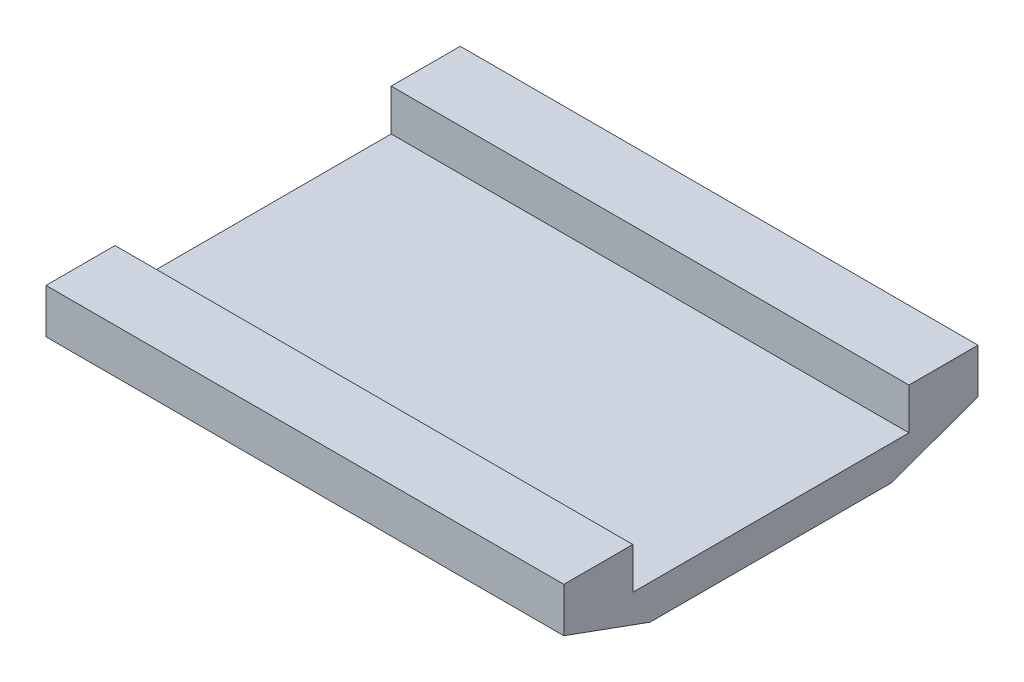
ISO-10303-21;
HEADER;
FILE_DESCRIPTION(('STEP AP214'),'2;1');
FILE_NAME('part.step','',(''),(''),'','','');
FILE_SCHEMA(('AUTOMOTIVE_DESIGN { 1 0 10303 214 1 1 1 1 }'));
ENDSEC;
DATA;
#1=APPLICATION_CONTEXT('core data for automotive mechanical design processes');
#2=APPLICATION_PROTOCOL_DEFINITION('international standard','automotive_design',2000,#1);
#3=PRODUCT_CONTEXT('',#1,'mechanical');
#4=PRODUCT('Part','Part','',(#3));
#5=PRODUCT_RELATED_PRODUCT_CATEGORY('part','',(#4));
#6=PRODUCT_DEFINITION_FORMATION('','',#4);
#7=PRODUCT_DEFINITION_CONTEXT('part definition',#1,'design');
#8=PRODUCT_DEFINITION('design','',#6,#7);
#9=PRODUCT_DEFINITION_SHAPE('','',#8);
#10=(LENGTH_UNIT() NAMED_UNIT(*) SI_UNIT(.MILLI.,.METRE.));
#11=(NAMED_UNIT(*) PLANE_ANGLE_UNIT() SI_UNIT($,.RADIAN.));
#12=(NAMED_UNIT(*) SI_UNIT($,.STERADIAN.) SOLID_ANGLE_UNIT());
#13=UNCERTAINTY_MEASURE_WITH_UNIT(LENGTH_MEASURE(1.E-05),#10,'distance_accuracy_value','');
#14=(GEOMETRIC_REPRESENTATION_CONTEXT(3) GLOBAL_UNCERTAINTY_ASSIGNED_CONTEXT((#13)) GLOBAL_UNIT_ASSIGNED_CONTEXT((#10,
#11,#12)) REPRESENTATION_CONTEXT('',''));
#15=CARTESIAN_POINT('',(0.,0.,0.));
#16=DIRECTION('',(0.,0.,1.));
#17=DIRECTION('',(1.,0.,0.));
#18=AXIS2_PLACEMENT_3D('',#15,#16,#17);
#19=CARTESIAN_POINT('',(-16.5364583333333,2.54,15.2112753615885));
#20=DIRECTION('',(-1.,0.,0.));
#21=DIRECTION('',(0.,0.,1.));
#22=AXIS2_PLACEMENT_3D('',#19,#20,#21);
#23=PLANE('',#22);
#24=DIRECTION('',(0.,-1.,0.));
#25=VECTOR('',#24,1.);
#26=CARTESIAN_POINT('',(-16.5364583333333,5.588,-10.1887246384115));
#27=LINE('',#26,#25);
#28=CARTESIAN_POINT('',(-16.5364583333333,5.588,-10.1887246384115));
#29=VERTEX_POINT('',#28);
#30=CARTESIAN_POINT('',(-16.5364583333333,2.31121098759039,-10.1887246384115));
#31=VERTEX_POINT('',#30);
#32=EDGE_CURVE('E234',#29,#31,#27,.T.);
#33=ORIENTED_EDGE('',*,*,#32,.T.);
#34=DIRECTION('',(0.,-0.342020143325666,0.939692620785909));
#35=VECTOR('',#34,1.);
#36=CARTESIAN_POINT('',(-16.5364583333333,-5.82542842502533,12.1665084179949));
#37=LINE('',#36,#35);
#38=CARTESIAN_POINT('',(-16.5364583333333,0.,-3.8387246384114));
#39=VERTEX_POINT('',#38);
#40=EDGE_CURVE('E214',#31,#39,#37,.T.);
#41=ORIENTED_EDGE('',*,*,#40,.T.);
#42=DIRECTION('',(0.,0.,-1.));
#43=VECTOR('',#42,1.);
#44=CARTESIAN_POINT('',(-16.5364583333333,0.,15.2112753615885));
#45=LINE('',#44,#43);
#46=CARTESIAN_POINT('',(-16.5364583333333,0.,13.9412753615885));
#47=VERTEX_POINT('',#46);
#48=EDGE_CURVE('E155',#47,#39,#45,.T.);
#49=ORIENTED_EDGE('',*,*,#48,.F.);
#50=DIRECTION('',(0.,0.342020143325666,0.939692620785909));
#51=VECTOR('',#50,1.);
#52=CARTESIAN_POINT('',(-16.5364583333333,0.705293689389866,15.879053847271));
#53=LINE('',#52,#51);
#54=CARTESIAN_POINT('',(-16.5364583333333,2.31121098759039,20.2912753615885));
#55=VERTEX_POINT('',#54);
#56=EDGE_CURVE('E211',#47,#55,#53,.T.);
#57=ORIENTED_EDGE('',*,*,#56,.T.);
#58=DIRECTION('',(0.,-1.,0.));
#59=VECTOR('',#58,1.);
#60=CARTESIAN_POINT('',(-16.5364583333333,5.588,20.2912753615885));
#61=LINE('',#60,#59);
#62=CARTESIAN_POINT('',(-16.5364583333333,5.588,20.2912753615885));
#63=VERTEX_POINT('',#62);
#64=EDGE_CURVE('E172',#63,#55,#61,.T.);
#65=ORIENTED_EDGE('',*,*,#64,.F.);
#66=DIRECTION('',(0.,0.,1.));
#67=VECTOR('',#66,1.);
#68=CARTESIAN_POINT('',(-16.5364583333333,5.588,15.2112753615885));
#69=LINE('',#68,#67);
#70=CARTESIAN_POINT('',(-16.5364583333333,5.588,15.2112753615885));
#71=VERTEX_POINT('',#70);
#72=EDGE_CURVE('E183',#71,#63,#69,.T.);
#73=ORIENTED_EDGE('',*,*,#72,.F.);
#74=DIRECTION('',(0.,-1.,0.));
#75=VECTOR('',#74,1.);
#76=CARTESIAN_POINT('',(-16.5364583333333,5.588,15.2112753615885));
#77=LINE('',#76,#75);
#78=CARTESIAN_POINT('',(-16.5364583333333,2.54,15.2112753615885));
#79=VERTEX_POINT('',#78);
#80=EDGE_CURVE('E169',#71,#79,#77,.T.);
#81=ORIENTED_EDGE('',*,*,#80,.T.);
#82=DIRECTION('',(0.,0.,-1.));
#83=VECTOR('',#82,1.);
#84=CARTESIAN_POINT('',(-16.5364583333333,2.54,15.2112753615885));
#85=LINE('',#84,#83);
#86=CARTESIAN_POINT('',(-16.5364583333333,2.54,-5.10872463841146));
#87=VERTEX_POINT('',#86);
#88=EDGE_CURVE('E153',#79,#87,#85,.T.);
#89=ORIENTED_EDGE('',*,*,#88,.T.);
#90=DIRECTION('',(0.,-1.,0.));
#91=VECTOR('',#90,1.);
#92=CARTESIAN_POINT('',(-16.5364583333333,5.588,-5.10872463841146));
#93=LINE('',#92,#91);
#94=CARTESIAN_POINT('',(-16.5364583333333,5.588,-5.10872463841146));
#95=VERTEX_POINT('',#94);
#96=EDGE_CURVE('E131',#95,#87,#93,.T.);
#97=ORIENTED_EDGE('',*,*,#96,.F.);
#98=DIRECTION('',(0.,0.,1.));
#99=VECTOR('',#98,1.);
#100=CARTESIAN_POINT('',(-16.5364583333333,5.588,-10.1887246384115));
#101=LINE('',#100,#99);
#102=EDGE_CURVE('E139',#29,#95,#101,.T.);
#103=ORIENTED_EDGE('',*,*,#102,.F.);
#104=EDGE_LOOP('',(#33,#41,#49,#57,#65,#73,#81,#89,#97,#103));
#105=FACE_BOUND('',#104,.T.);
#106=ADVANCED_FACE('F47',(#105),#23,.T.);
#107=CARTESIAN_POINT('',(21.5635416666667,2.54,15.2112753615885));
#108=DIRECTION('',(-1.,0.,0.));
#109=DIRECTION('',(0.,0.,1.));
#110=AXIS2_PLACEMENT_3D('',#107,#108,#109);
#111=PLANE('',#110);
#112=DIRECTION('',(0.,0.,-1.));
#113=VECTOR('',#112,1.);
#114=CARTESIAN_POINT('',(21.5635416666667,0.,15.2112753615885));
#115=LINE('',#114,#113);
#116=CARTESIAN_POINT('',(21.5635416666667,0.,13.9412753615885));
#117=VERTEX_POINT('',#116);
#118=CARTESIAN_POINT('',(21.5635416666667,0.,-3.8387246384114));
#119=VERTEX_POINT('',#118);
#120=EDGE_CURVE('E159',#117,#119,#115,.T.);
#121=ORIENTED_EDGE('',*,*,#120,.T.);
#122=DIRECTION('',(0.,0.342020143325666,-0.939692620785909));
#123=VECTOR('',#122,1.);
#124=CARTESIAN_POINT('',(21.5635416666667,2.31121098759039,-10.1887246384115));
#125=LINE('',#124,#123);
#126=CARTESIAN_POINT('',(21.5635416666667,2.31121098759039,-10.1887246384115));
#127=VERTEX_POINT('',#126);
#128=EDGE_CURVE('E57',#119,#127,#125,.T.);
#129=ORIENTED_EDGE('',*,*,#128,.T.);
#130=DIRECTION('',(0.,-1.,0.));
#131=VECTOR('',#130,1.);
#132=CARTESIAN_POINT('',(21.5635416666667,5.588,-10.1887246384115));
#133=LINE('',#132,#131);
#134=CARTESIAN_POINT('',(21.5635416666667,5.588,-10.1887246384115));
#135=VERTEX_POINT('',#134);
#136=EDGE_CURVE('E161',#135,#127,#133,.T.);
#137=ORIENTED_EDGE('',*,*,#136,.F.);
#138=DIRECTION('',(0.,0.,-1.));
#139=VECTOR('',#138,1.);
#140=CARTESIAN_POINT('',(21.5635416666667,5.588,-10.1887246384115));
#141=LINE('',#140,#139);
#142=CARTESIAN_POINT('',(21.5635416666667,5.588,-5.10872463841146));
#143=VERTEX_POINT('',#142);
#144=EDGE_CURVE('E138',#143,#135,#141,.T.);
#145=ORIENTED_EDGE('',*,*,#144,.F.);
#146=DIRECTION('',(0.,-1.,0.));
#147=VECTOR('',#146,1.);
#148=CARTESIAN_POINT('',(21.5635416666667,5.588,-5.10872463841146));
#149=LINE('',#148,#147);
#150=CARTESIAN_POINT('',(21.5635416666667,2.54,-5.10872463841146));
#151=VERTEX_POINT('',#150);
#152=EDGE_CURVE('E134',#143,#151,#149,.T.);
#153=ORIENTED_EDGE('',*,*,#152,.T.);
#154=DIRECTION('',(0.,0.,-1.));
#155=VECTOR('',#154,1.);
#156=CARTESIAN_POINT('',(21.5635416666667,2.54,15.2112753615885));
#157=LINE('',#156,#155);
#158=CARTESIAN_POINT('',(21.5635416666667,2.54,15.2112753615885));
#159=VERTEX_POINT('',#158);
#160=EDGE_CURVE('E201',#159,#151,#157,.T.);
#161=ORIENTED_EDGE('',*,*,#160,.F.);
#162=DIRECTION('',(0.,-1.,0.));
#163=VECTOR('',#162,1.);
#164=CARTESIAN_POINT('',(21.5635416666667,5.588,15.2112753615885));
#165=LINE('',#164,#163);
#166=CARTESIAN_POINT('',(21.5635416666667,5.588,15.2112753615885));
#167=VERTEX_POINT('',#166);
#168=EDGE_CURVE('E165',#167,#159,#165,.T.);
#169=ORIENTED_EDGE('',*,*,#168,.F.);
#170=DIRECTION('',(0.,0.,-1.));
#171=VECTOR('',#170,1.);
#172=CARTESIAN_POINT('',(21.5635416666667,5.588,15.2112753615885));
#173=LINE('',#172,#171);
#174=CARTESIAN_POINT('',(21.5635416666667,5.588,20.2912753615885));
#175=VERTEX_POINT('',#174);
#176=EDGE_CURVE('E149',#175,#167,#173,.T.);
#177=ORIENTED_EDGE('',*,*,#176,.F.);
#178=DIRECTION('',(0.,-1.,0.));
#179=VECTOR('',#178,1.);
#180=CARTESIAN_POINT('',(21.5635416666667,5.588,20.2912753615885));
#181=LINE('',#180,#179);
#182=CARTESIAN_POINT('',(21.5635416666667,2.31121098759039,20.2912753615885));
#183=VERTEX_POINT('',#182);
#184=EDGE_CURVE('E176',#175,#183,#181,.T.);
#185=ORIENTED_EDGE('',*,*,#184,.T.);
#186=DIRECTION('',(0.,-0.342020143325666,-0.939692620785909));
#187=VECTOR('',#186,1.);
#188=CARTESIAN_POINT('',(21.5635416666667,2.31121098759039,20.2912753615885));
#189=LINE('',#188,#187);
#190=EDGE_CURVE('E64',#183,#117,#189,.T.);
#191=ORIENTED_EDGE('',*,*,#190,.T.);
#192=EDGE_LOOP('',(#121,#129,#137,#145,#153,#161,#169,#177,#185,#191));
#193=FACE_BOUND('',#192,.T.);
#194=ADVANCED_FACE('F228',(#193),#111,.F.);
#195=CARTESIAN_POINT('',(0.,2.54,0.));
#196=DIRECTION('',(0.,-1.,0.));
#197=DIRECTION('',(0.,0.,-1.));
#198=AXIS2_PLACEMENT_3D('',#195,#196,#197);
#199=PLANE('',#198);
#200=DIRECTION('',(-1.,0.,0.));
#201=VECTOR('',#200,1.);
#202=CARTESIAN_POINT('',(21.5635416666667,2.54,-5.10872463841146));
#203=LINE('',#202,#201);
#204=EDGE_CURVE('E192',#151,#87,#203,.T.);
#205=ORIENTED_EDGE('',*,*,#204,.T.);
#206=ORIENTED_EDGE('',*,*,#88,.F.);
#207=DIRECTION('',(-1.,0.,0.));
#208=VECTOR('',#207,1.);
#209=CARTESIAN_POINT('',(21.5635416666667,2.54,15.2112753615885));
#210=LINE('',#209,#208);
#211=EDGE_CURVE('E197',#159,#79,#210,.T.);
#212=ORIENTED_EDGE('',*,*,#211,.F.);
#213=ORIENTED_EDGE('',*,*,#160,.T.);
#214=EDGE_LOOP('',(#205,#206,#212,#213));
#215=FACE_BOUND('',#214,.T.);
#216=ADVANCED_FACE('F254',(#215),#199,.F.);
#217=CARTESIAN_POINT('',(0.,0.,0.));
#218=DIRECTION('',(0.,-1.,0.));
#219=DIRECTION('',(0.,0.,-1.));
#220=AXIS2_PLACEMENT_3D('',#217,#218,#219);
#221=PLANE('',#220);
#222=ORIENTED_EDGE('',*,*,#48,.T.);
#223=DIRECTION('',(1.,0.,0.));
#224=VECTOR('',#223,1.);
#225=CARTESIAN_POINT('',(21.5635416666667,0.,-3.8387246384114));
#226=LINE('',#225,#224);
#227=EDGE_CURVE('E71',#39,#119,#226,.T.);
#228=ORIENTED_EDGE('',*,*,#227,.T.);
#229=ORIENTED_EDGE('',*,*,#120,.F.);
#230=DIRECTION('',(-1.,0.,0.));
#231=VECTOR('',#230,1.);
#232=CARTESIAN_POINT('',(-16.5364583333333,0.,13.9412753615885));
#233=LINE('',#232,#231);
#234=EDGE_CURVE('E217',#117,#47,#233,.T.);
#235=ORIENTED_EDGE('',*,*,#234,.T.);
#236=EDGE_LOOP('',(#222,#228,#229,#235));
#237=FACE_BOUND('',#236,.T.);
#238=ADVANCED_FACE('F238',(#237),#221,.T.);
#239=CARTESIAN_POINT('',(21.5635416666667,5.588,15.2112753615885));
#240=DIRECTION('',(0.,0.,1.));
#241=DIRECTION('',(1.,0.,0.));
#242=AXIS2_PLACEMENT_3D('',#239,#240,#241);
#243=PLANE('',#242);
#244=ORIENTED_EDGE('',*,*,#168,.T.);
#245=ORIENTED_EDGE('',*,*,#211,.T.);
#246=ORIENTED_EDGE('',*,*,#80,.F.);
#247=DIRECTION('',(-1.,0.,0.));
#248=VECTOR('',#247,1.);
#249=CARTESIAN_POINT('',(21.5635416666667,5.588,15.2112753615885));
#250=LINE('',#249,#248);
#251=EDGE_CURVE('E186',#167,#71,#250,.T.);
#252=ORIENTED_EDGE('',*,*,#251,.F.);
#253=EDGE_LOOP('',(#244,#245,#246,#252));
#254=FACE_BOUND('',#253,.T.);
#255=ADVANCED_FACE('F251',(#254),#243,.F.);
#256=CARTESIAN_POINT('',(21.5635416666667,5.588,20.2912753615885));
#257=DIRECTION('',(0.,0.,-1.));
#258=DIRECTION('',(-1.,0.,0.));
#259=AXIS2_PLACEMENT_3D('',#256,#257,#258);
#260=PLANE('',#259);
#261=ORIENTED_EDGE('',*,*,#64,.T.);
#262=DIRECTION('',(1.,0.,0.));
#263=VECTOR('',#262,1.);
#264=CARTESIAN_POINT('',(21.5635416666667,2.31121098759039,20.2912753615885));
#265=LINE('',#264,#263);
#266=EDGE_CURVE('E11',#55,#183,#265,.T.);
#267=ORIENTED_EDGE('',*,*,#266,.T.);
#268=ORIENTED_EDGE('',*,*,#184,.F.);
#269=DIRECTION('',(1.,0.,0.));
#270=VECTOR('',#269,1.);
#271=CARTESIAN_POINT('',(21.5635416666667,5.588,20.2912753615885));
#272=LINE('',#271,#270);
#273=EDGE_CURVE('E180',#63,#175,#272,.T.);
#274=ORIENTED_EDGE('',*,*,#273,.F.);
#275=EDGE_LOOP('',(#261,#267,#268,#274));
#276=FACE_BOUND('',#275,.T.);
#277=ADVANCED_FACE('F243',(#276),#260,.F.);
#278=CARTESIAN_POINT('',(0.,5.588,0.));
#279=DIRECTION('',(0.,-1.,0.));
#280=DIRECTION('',(0.,0.,-1.));
#281=AXIS2_PLACEMENT_3D('',#278,#279,#280);
#282=PLANE('',#281);
#283=ORIENTED_EDGE('',*,*,#176,.T.);
#284=ORIENTED_EDGE('',*,*,#251,.T.);
#285=ORIENTED_EDGE('',*,*,#72,.T.);
#286=ORIENTED_EDGE('',*,*,#273,.T.);
#287=EDGE_LOOP('',(#283,#284,#285,#286));
#288=FACE_BOUND('',#287,.T.);
#289=ADVANCED_FACE('F247',(#288),#282,.F.);
#290=CARTESIAN_POINT('',(-16.5364583333333,5.588,-5.10872463841146));
#291=DIRECTION('',(0.,0.,-1.));
#292=DIRECTION('',(-1.,0.,0.));
#293=AXIS2_PLACEMENT_3D('',#290,#291,#292);
#294=PLANE('',#293);
#295=ORIENTED_EDGE('',*,*,#204,.F.);
#296=ORIENTED_EDGE('',*,*,#152,.F.);
#297=DIRECTION('',(1.,0.,0.));
#298=VECTOR('',#297,1.);
#299=CARTESIAN_POINT('',(-16.5364583333333,5.588,-5.10872463841146));
#300=LINE('',#299,#298);
#301=EDGE_CURVE('E127',#95,#143,#300,.T.);
#302=ORIENTED_EDGE('',*,*,#301,.F.);
#303=ORIENTED_EDGE('',*,*,#96,.T.);
#304=EDGE_LOOP('',(#295,#296,#302,#303));
#305=FACE_BOUND('',#304,.T.);
#306=ADVANCED_FACE('F129',(#305),#294,.F.);
#307=CARTESIAN_POINT('',(-16.5364583333333,5.588,-10.1887246384115));
#308=DIRECTION('',(0.,0.,1.));
#309=DIRECTION('',(1.,0.,0.));
#310=AXIS2_PLACEMENT_3D('',#307,#308,#309);
#311=PLANE('',#310);
#312=ORIENTED_EDGE('',*,*,#136,.T.);
#313=DIRECTION('',(-1.,0.,0.));
#314=VECTOR('',#313,1.);
#315=CARTESIAN_POINT('',(-16.5364583333333,2.31121098759039,-10.1887246384115));
#316=LINE('',#315,#314);
#317=EDGE_CURVE('E204',#127,#31,#316,.T.);
#318=ORIENTED_EDGE('',*,*,#317,.T.);
#319=ORIENTED_EDGE('',*,*,#32,.F.);
#320=DIRECTION('',(-1.,0.,0.));
#321=VECTOR('',#320,1.);
#322=CARTESIAN_POINT('',(-16.5364583333333,5.588,-10.1887246384115));
#323=LINE('',#322,#321);
#324=EDGE_CURVE('E144',#135,#29,#323,.T.);
#325=ORIENTED_EDGE('',*,*,#324,.F.);
#326=EDGE_LOOP('',(#312,#318,#319,#325));
#327=FACE_BOUND('',#326,.T.);
#328=ADVANCED_FACE('F232',(#327),#311,.F.);
#329=CARTESIAN_POINT('',(0.,5.588,0.));
#330=DIRECTION('',(0.,1.,0.));
#331=DIRECTION('',(0.,0.,1.));
#332=AXIS2_PLACEMENT_3D('',#329,#330,#331);
#333=PLANE('',#332);
#334=ORIENTED_EDGE('',*,*,#102,.T.);
#335=ORIENTED_EDGE('',*,*,#301,.T.);
#336=ORIENTED_EDGE('',*,*,#144,.T.);
#337=ORIENTED_EDGE('',*,*,#324,.T.);
#338=EDGE_LOOP('',(#334,#335,#336,#337));
#339=FACE_BOUND('',#338,.T.);
#340=ADVANCED_FACE('F142',(#339),#333,.T.);
#341=CARTESIAN_POINT('',(-16.5364583333333,2.31121098759039,-10.1887246384115));
#342=DIRECTION('',(0.,-0.939692620785909,-0.342020143325666));
#343=DIRECTION('',(1.,0.,0.));
#344=AXIS2_PLACEMENT_3D('',#341,#342,#343);
#345=PLANE('',#344);
#346=ORIENTED_EDGE('',*,*,#128,.F.);
#347=ORIENTED_EDGE('',*,*,#227,.F.);
#348=ORIENTED_EDGE('',*,*,#40,.F.);
#349=ORIENTED_EDGE('',*,*,#317,.F.);
#350=EDGE_LOOP('',(#346,#347,#348,#349));
#351=FACE_BOUND('',#350,.T.);
#352=ADVANCED_FACE('F235',(#351),#345,.T.);
#353=CARTESIAN_POINT('',(21.5635416666667,2.31121098759039,20.2912753615885));
#354=DIRECTION('',(0.,-0.939692620785909,0.342020143325666));
#355=DIRECTION('',(-1.,0.,0.));
#356=AXIS2_PLACEMENT_3D('',#353,#354,#355);
#357=PLANE('',#356);
#358=ORIENTED_EDGE('',*,*,#56,.F.);
#359=ORIENTED_EDGE('',*,*,#234,.F.);
#360=ORIENTED_EDGE('',*,*,#190,.F.);
#361=ORIENTED_EDGE('',*,*,#266,.F.);
#362=EDGE_LOOP('',(#358,#359,#360,#361));
#363=FACE_BOUND('',#362,.T.);
#364=ADVANCED_FACE('F50',(#363),#357,.T.);
#365=CLOSED_SHELL('',(#106,#194,#216,#238,#255,#277,#289,#306,#328,#340,#352,#364));
#366=MANIFOLD_SOLID_BREP('B2',#365);
#367=ADVANCED_BREP_SHAPE_REPRESENTATION('',(#18,#366),#14);
#368=SHAPE_DEFINITION_REPRESENTATION(#9,#367);
ENDSEC;
END-ISO-10303-21;
